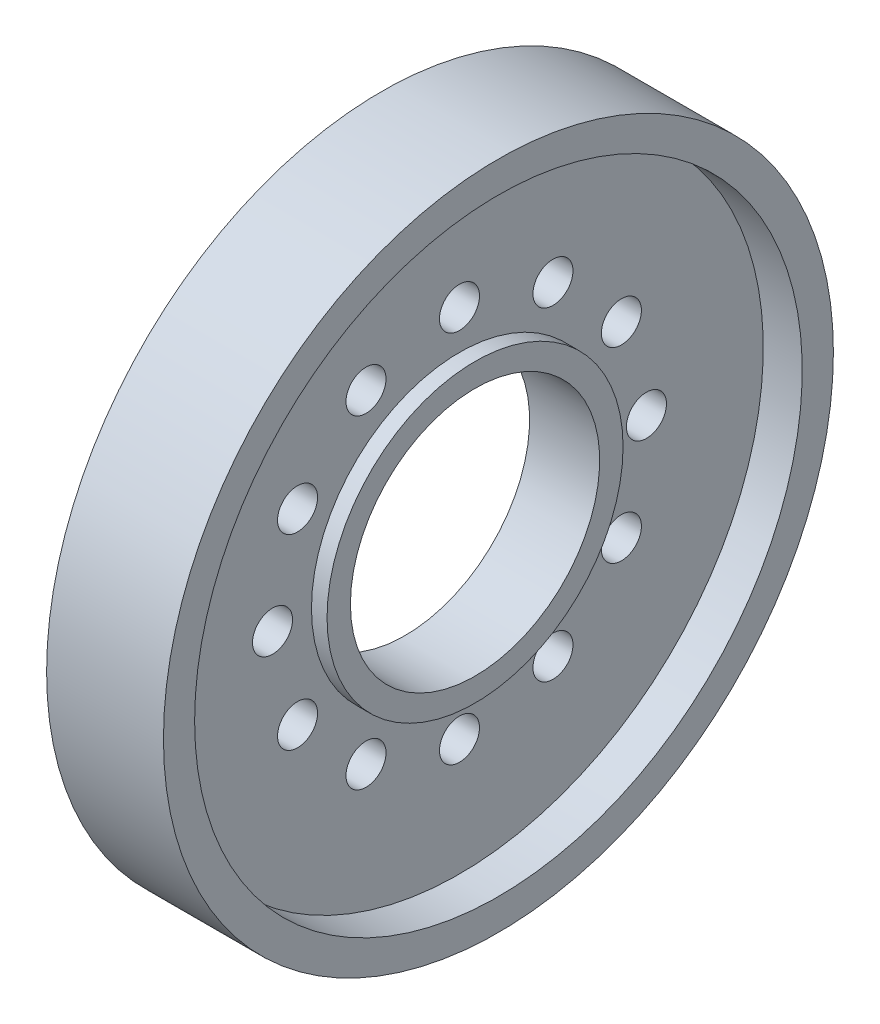
ISO-10303-21;
HEADER;
FILE_DESCRIPTION(('STEP AP214'),'2;1');
FILE_NAME('part.step','',(''),(''),'','','');
FILE_SCHEMA(('AUTOMOTIVE_DESIGN { 1 0 10303 214 1 1 1 1 }'));
ENDSEC;
DATA;
#1=APPLICATION_CONTEXT('core data for automotive mechanical design processes');
#2=APPLICATION_PROTOCOL_DEFINITION('international standard','automotive_design',2000,#1);
#3=PRODUCT_CONTEXT('',#1,'mechanical');
#4=PRODUCT('Part','Part','',(#3));
#5=PRODUCT_RELATED_PRODUCT_CATEGORY('part','',(#4));
#6=PRODUCT_DEFINITION_FORMATION('','',#4);
#7=PRODUCT_DEFINITION_CONTEXT('part definition',#1,'design');
#8=PRODUCT_DEFINITION('design','',#6,#7);
#9=PRODUCT_DEFINITION_SHAPE('','',#8);
#10=(LENGTH_UNIT() NAMED_UNIT(*) SI_UNIT(.MILLI.,.METRE.));
#11=(NAMED_UNIT(*) PLANE_ANGLE_UNIT() SI_UNIT($,.RADIAN.));
#12=(NAMED_UNIT(*) SI_UNIT($,.STERADIAN.) SOLID_ANGLE_UNIT());
#13=UNCERTAINTY_MEASURE_WITH_UNIT(LENGTH_MEASURE(1.E-05),#10,'distance_accuracy_value','');
#14=(GEOMETRIC_REPRESENTATION_CONTEXT(3) GLOBAL_UNCERTAINTY_ASSIGNED_CONTEXT((#13)) GLOBAL_UNIT_ASSIGNED_CONTEXT((#10,
#11,#12)) REPRESENTATION_CONTEXT('',''));
#15=CARTESIAN_POINT('',(0.,0.,0.));
#16=DIRECTION('',(0.,0.,1.));
#17=DIRECTION('',(1.,0.,0.));
#18=AXIS2_PLACEMENT_3D('',#15,#16,#17);
#19=CARTESIAN_POINT('',(-9.525,49.53,0.));
#20=DIRECTION('',(1.,0.,0.));
#21=DIRECTION('',(0.,0.,-1.));
#22=AXIS2_PLACEMENT_3D('',#19,#20,#21);
#23=PLANE('',#22);
#24=CARTESIAN_POINT('',(-9.525,0.,0.));
#25=DIRECTION('',(-1.,0.,0.));
#26=DIRECTION('',(0.,0.,1.));
#27=AXIS2_PLACEMENT_3D('',#24,#25,#26);
#28=CIRCLE('',#27,49.53);
#29=CARTESIAN_POINT('',(-9.525,0.,49.53));
#30=VERTEX_POINT('',#29);
#31=EDGE_CURVE('E63',#30,#30,#28,.T.);
#32=ORIENTED_EDGE('',*,*,#31,.F.);
#33=EDGE_LOOP('',(#32));
#34=FACE_BOUND('',#33,.T.);
#35=CARTESIAN_POINT('',(-9.525,0.,0.));
#36=DIRECTION('',(-1.,0.,0.));
#37=DIRECTION('',(0.,0.,1.));
#38=AXIS2_PLACEMENT_3D('',#35,#36,#37);
#39=CIRCLE('',#38,54.61);
#40=CARTESIAN_POINT('',(-9.525,0.,54.61));
#41=VERTEX_POINT('',#40);
#42=EDGE_CURVE('E10',#41,#41,#39,.T.);
#43=ORIENTED_EDGE('',*,*,#42,.T.);
#44=EDGE_LOOP('',(#43));
#45=FACE_BOUND('',#44,.T.);
#46=ADVANCED_FACE('F41',(#34,#45),#23,.F.);
#47=CARTESIAN_POINT('',(-31.2933707865168,0.,0.));
#48=DIRECTION('',(-1.,0.,0.));
#49=DIRECTION('',(0.,0.,1.));
#50=AXIS2_PLACEMENT_3D('',#47,#48,#49);
#51=CYLINDRICAL_SURFACE('',#50,54.61);
#52=ORIENTED_EDGE('',*,*,#42,.F.);
#53=EDGE_LOOP('',(#52));
#54=FACE_BOUND('',#53,.T.);
#55=CARTESIAN_POINT('',(9.525,0.,0.));
#56=DIRECTION('',(-1.,0.,0.));
#57=DIRECTION('',(0.,0.,1.));
#58=AXIS2_PLACEMENT_3D('',#55,#56,#57);
#59=CIRCLE('',#58,54.61);
#60=CARTESIAN_POINT('',(9.525,0.,54.61));
#61=VERTEX_POINT('',#60);
#62=EDGE_CURVE('E49',#61,#61,#59,.T.);
#63=ORIENTED_EDGE('',*,*,#62,.T.);
#64=EDGE_LOOP('',(#63));
#65=FACE_BOUND('',#64,.T.);
#66=ADVANCED_FACE('F215',(#54,#65),#51,.T.);
#67=CARTESIAN_POINT('',(9.525,54.61,0.));
#68=DIRECTION('',(-1.,0.,0.));
#69=DIRECTION('',(0.,0.,1.));
#70=AXIS2_PLACEMENT_3D('',#67,#68,#69);
#71=PLANE('',#70);
#72=ORIENTED_EDGE('',*,*,#62,.F.);
#73=EDGE_LOOP('',(#72));
#74=FACE_BOUND('',#73,.T.);
#75=CARTESIAN_POINT('',(9.525,0.,0.));
#76=DIRECTION('',(-1.,0.,0.));
#77=DIRECTION('',(0.,0.,1.));
#78=AXIS2_PLACEMENT_3D('',#75,#76,#77);
#79=CIRCLE('',#78,49.53);
#80=CARTESIAN_POINT('',(9.525,0.,49.53));
#81=VERTEX_POINT('',#80);
#82=EDGE_CURVE('E55',#81,#81,#79,.T.);
#83=ORIENTED_EDGE('',*,*,#82,.T.);
#84=EDGE_LOOP('',(#83));
#85=FACE_BOUND('',#84,.T.);
#86=ADVANCED_FACE('F156',(#74,#85),#71,.F.);
#87=CARTESIAN_POINT('',(-31.2933707865168,0.,0.));
#88=DIRECTION('',(-1.,0.,0.));
#89=DIRECTION('',(0.,0.,1.));
#90=AXIS2_PLACEMENT_3D('',#87,#88,#89);
#91=CYLINDRICAL_SURFACE('',#90,49.53);
#92=ORIENTED_EDGE('',*,*,#82,.F.);
#93=EDGE_LOOP('',(#92));
#94=FACE_BOUND('',#93,.T.);
#95=CARTESIAN_POINT('',(3.175,0.,0.));
#96=DIRECTION('',(-1.,0.,0.));
#97=DIRECTION('',(0.,0.,1.));
#98=AXIS2_PLACEMENT_3D('',#95,#96,#97);
#99=CIRCLE('',#98,49.53);
#100=CARTESIAN_POINT('',(3.175,0.,49.53));
#101=VERTEX_POINT('',#100);
#102=EDGE_CURVE('E149',#101,#101,#99,.T.);
#103=ORIENTED_EDGE('',*,*,#102,.T.);
#104=EDGE_LOOP('',(#103));
#105=FACE_BOUND('',#104,.T.);
#106=ADVANCED_FACE('F158',(#94,#105),#91,.F.);
#107=CARTESIAN_POINT('',(3.175,49.53,0.));
#108=DIRECTION('',(-1.,0.,0.));
#109=DIRECTION('',(0.,0.,1.));
#110=AXIS2_PLACEMENT_3D('',#107,#108,#109);
#111=PLANE('',#110);
#112=CARTESIAN_POINT('',(3.175,15.2399999999999,-26.3964543073497));
#113=DIRECTION('',(1.,0.,0.));
#114=DIRECTION('',(0.,-0.86602540378444,-0.499999999999998));
#115=AXIS2_PLACEMENT_3D('',#112,#113,#114);
#116=CIRCLE('',#115,3.2639);
#117=CARTESIAN_POINT('',(3.175,12.4133796845879,-28.0284043073497));
#118=VERTEX_POINT('',#117);
#119=EDGE_CURVE('E301',#118,#118,#116,.T.);
#120=ORIENTED_EDGE('',*,*,#119,.F.);
#121=EDGE_LOOP('',(#120));
#122=FACE_BOUND('',#121,.T.);
#123=CARTESIAN_POINT('',(3.175,-1.06420351207939E-13,-30.48));
#124=DIRECTION('',(1.,0.,0.));
#125=DIRECTION('',(0.,-1.,0.));
#126=AXIS2_PLACEMENT_3D('',#123,#124,#125);
#127=CIRCLE('',#126,3.2639);
#128=CARTESIAN_POINT('',(3.175,-3.26390000000011,-30.48));
#129=VERTEX_POINT('',#128);
#130=EDGE_CURVE('E305',#129,#129,#127,.T.);
#131=ORIENTED_EDGE('',*,*,#130,.F.);
#132=EDGE_LOOP('',(#131));
#133=FACE_BOUND('',#132,.T.);
#134=CARTESIAN_POINT('',(3.175,-15.2400000000001,-26.3964543073496));
#135=DIRECTION('',(1.,0.,0.));
#136=DIRECTION('',(0.,-0.866025403784436,0.500000000000004));
#137=AXIS2_PLACEMENT_3D('',#134,#135,#136);
#138=CIRCLE('',#137,3.2639);
#139=CARTESIAN_POINT('',(3.175,-18.0666203154121,-24.7645043073496));
#140=VERTEX_POINT('',#139);
#141=EDGE_CURVE('E309',#140,#140,#138,.T.);
#142=ORIENTED_EDGE('',*,*,#141,.F.);
#143=EDGE_LOOP('',(#142));
#144=FACE_BOUND('',#143,.T.);
#145=CARTESIAN_POINT('',(3.175,-26.3964543073498,-15.2399999999998));
#146=DIRECTION('',(1.,0.,0.));
#147=DIRECTION('',(0.,-0.499999999999995,0.866025403784442));
#148=AXIS2_PLACEMENT_3D('',#145,#146,#147);
#149=CIRCLE('',#148,3.2639);
#150=CARTESIAN_POINT('',(3.175,-28.0284043073498,-12.4133796845878));
#151=VERTEX_POINT('',#150);
#152=EDGE_CURVE('E313',#151,#151,#149,.T.);
#153=ORIENTED_EDGE('',*,*,#152,.F.);
#154=EDGE_LOOP('',(#153));
#155=FACE_BOUND('',#154,.T.);
#156=CARTESIAN_POINT('',(3.175,-30.48,0.));
#157=DIRECTION('',(1.,0.,0.));
#158=DIRECTION('',(0.,0.,1.));
#159=AXIS2_PLACEMENT_3D('',#156,#157,#158);
#160=CIRCLE('',#159,3.2639);
#161=CARTESIAN_POINT('',(3.175,-30.48,3.2639));
#162=VERTEX_POINT('',#161);
#163=EDGE_CURVE('E317',#162,#162,#160,.T.);
#164=ORIENTED_EDGE('',*,*,#163,.F.);
#165=EDGE_LOOP('',(#164));
#166=FACE_BOUND('',#165,.T.);
#167=CARTESIAN_POINT('',(3.175,-26.3964543073496,15.2400000000002));
#168=DIRECTION('',(1.,0.,0.));
#169=DIRECTION('',(0.,0.500000000000007,0.866025403784435));
#170=AXIS2_PLACEMENT_3D('',#167,#168,#169);
#171=CIRCLE('',#170,3.2639);
#172=CARTESIAN_POINT('',(3.175,-24.7645043073495,18.0666203154122));
#173=VERTEX_POINT('',#172);
#174=EDGE_CURVE('E321',#173,#173,#171,.T.);
#175=ORIENTED_EDGE('',*,*,#174,.F.);
#176=EDGE_LOOP('',(#175));
#177=FACE_BOUND('',#176,.T.);
#178=CARTESIAN_POINT('',(3.175,-15.2399999999998,26.3964543073498));
#179=DIRECTION('',(1.,0.,0.));
#180=DIRECTION('',(0.,0.866025403784443,0.499999999999992));
#181=AXIS2_PLACEMENT_3D('',#178,#179,#180);
#182=CIRCLE('',#181,3.2639);
#183=CARTESIAN_POINT('',(3.175,-12.4133796845877,28.0284043073498));
#184=VERTEX_POINT('',#183);
#185=EDGE_CURVE('E297',#184,#184,#182,.T.);
#186=ORIENTED_EDGE('',*,*,#185,.F.);
#187=EDGE_LOOP('',(#186));
#188=FACE_BOUND('',#187,.T.);
#189=CARTESIAN_POINT('',(3.175,3.19261053623816E-13,30.48));
#190=DIRECTION('',(1.,0.,0.));
#191=DIRECTION('',(0.,1.,0.));
#192=AXIS2_PLACEMENT_3D('',#189,#190,#191);
#193=CIRCLE('',#192,3.2639);
#194=CARTESIAN_POINT('',(3.175,3.26390000000032,30.48));
#195=VERTEX_POINT('',#194);
#196=EDGE_CURVE('E291',#195,#195,#193,.T.);
#197=ORIENTED_EDGE('',*,*,#196,.F.);
#198=EDGE_LOOP('',(#197));
#199=FACE_BOUND('',#198,.T.);
#200=CARTESIAN_POINT('',(3.175,15.2400000000003,26.3964543073495));
#201=DIRECTION('',(1.,0.,0.));
#202=DIRECTION('',(0.,0.866025403784433,-0.50000000000001));
#203=AXIS2_PLACEMENT_3D('',#200,#201,#202);
#204=CIRCLE('',#203,3.2639);
#205=CARTESIAN_POINT('',(3.175,18.0666203154123,24.7645043073495));
#206=VERTEX_POINT('',#205);
#207=EDGE_CURVE('E277',#206,#206,#204,.T.);
#208=ORIENTED_EDGE('',*,*,#207,.F.);
#209=EDGE_LOOP('',(#208));
#210=FACE_BOUND('',#209,.T.);
#211=CARTESIAN_POINT('',(3.175,26.3964543073499,15.2399999999997));
#212=DIRECTION('',(1.,0.,0.));
#213=DIRECTION('',(0.,0.499999999999989,-0.866025403784445));
#214=AXIS2_PLACEMENT_3D('',#211,#212,#213);
#215=CIRCLE('',#214,3.2639);
#216=CARTESIAN_POINT('',(3.175,28.0284043073498,12.4133796845876));
#217=VERTEX_POINT('',#216);
#218=EDGE_CURVE('E292',#217,#217,#215,.T.);
#219=ORIENTED_EDGE('',*,*,#218,.F.);
#220=EDGE_LOOP('',(#219));
#221=FACE_BOUND('',#220,.T.);
#222=CARTESIAN_POINT('',(3.175,26.3964543073497,-15.24));
#223=DIRECTION('',(1.,0.,0.));
#224=DIRECTION('',(0.,-0.500000000000001,-0.866025403784438));
#225=AXIS2_PLACEMENT_3D('',#222,#223,#224);
#226=CIRCLE('',#225,3.2639);
#227=CARTESIAN_POINT('',(3.175,24.7645043073497,-18.0666203154121));
#228=VERTEX_POINT('',#227);
#229=EDGE_CURVE('E70',#228,#228,#226,.T.);
#230=ORIENTED_EDGE('',*,*,#229,.F.);
#231=EDGE_LOOP('',(#230));
#232=FACE_BOUND('',#231,.T.);
#233=CARTESIAN_POINT('',(3.175,30.48,0.));
#234=DIRECTION('',(1.,0.,0.));
#235=DIRECTION('',(0.,0.,-1.));
#236=AXIS2_PLACEMENT_3D('',#233,#234,#235);
#237=CIRCLE('',#236,3.2639);
#238=CARTESIAN_POINT('',(3.175,30.48,-3.2639));
#239=VERTEX_POINT('',#238);
#240=EDGE_CURVE('E64',#239,#239,#237,.T.);
#241=ORIENTED_EDGE('',*,*,#240,.F.);
#242=EDGE_LOOP('',(#241));
#243=FACE_BOUND('',#242,.T.);
#244=ORIENTED_EDGE('',*,*,#102,.F.);
#245=EDGE_LOOP('',(#244));
#246=FACE_BOUND('',#245,.T.);
#247=CARTESIAN_POINT('',(3.175,0.,0.));
#248=DIRECTION('',(-1.,0.,0.));
#249=DIRECTION('',(0.,0.,1.));
#250=AXIS2_PLACEMENT_3D('',#247,#248,#249);
#251=CIRCLE('',#250,24.13);
#252=CARTESIAN_POINT('',(3.175,0.,24.13));
#253=VERTEX_POINT('',#252);
#254=EDGE_CURVE('E145',#253,#253,#251,.T.);
#255=ORIENTED_EDGE('',*,*,#254,.T.);
#256=EDGE_LOOP('',(#255));
#257=FACE_BOUND('',#256,.T.);
#258=ADVANCED_FACE('F161',(#122,#133,#144,#155,#166,#177,#188,#199,#210,#221,#232,#243,#246,
#257),#111,.F.);
#259=CARTESIAN_POINT('',(-31.2933707865168,0.,0.));
#260=DIRECTION('',(-1.,0.,0.));
#261=DIRECTION('',(0.,0.,1.));
#262=AXIS2_PLACEMENT_3D('',#259,#260,#261);
#263=CYLINDRICAL_SURFACE('',#262,24.13);
#264=ORIENTED_EDGE('',*,*,#254,.F.);
#265=EDGE_LOOP('',(#264));
#266=FACE_BOUND('',#265,.T.);
#267=CARTESIAN_POINT('',(5.715,0.,0.));
#268=DIRECTION('',(-1.,0.,0.));
#269=DIRECTION('',(0.,0.,1.));
#270=AXIS2_PLACEMENT_3D('',#267,#268,#269);
#271=CIRCLE('',#270,24.13);
#272=CARTESIAN_POINT('',(5.715,0.,24.13));
#273=VERTEX_POINT('',#272);
#274=EDGE_CURVE('E141',#273,#273,#271,.T.);
#275=ORIENTED_EDGE('',*,*,#274,.T.);
#276=EDGE_LOOP('',(#275));
#277=FACE_BOUND('',#276,.T.);
#278=ADVANCED_FACE('F167',(#266,#277),#263,.T.);
#279=CARTESIAN_POINT('',(5.715,20.32,0.));
#280=DIRECTION('',(-1.,0.,0.));
#281=DIRECTION('',(0.,0.,1.));
#282=AXIS2_PLACEMENT_3D('',#279,#280,#281);
#283=PLANE('',#282);
#284=ORIENTED_EDGE('',*,*,#274,.F.);
#285=EDGE_LOOP('',(#284));
#286=FACE_BOUND('',#285,.T.);
#287=CARTESIAN_POINT('',(5.715,0.,0.));
#288=DIRECTION('',(-1.,0.,0.));
#289=DIRECTION('',(0.,0.,1.));
#290=AXIS2_PLACEMENT_3D('',#287,#288,#289);
#291=CIRCLE('',#290,20.32);
#292=CARTESIAN_POINT('',(5.715,0.,20.32));
#293=VERTEX_POINT('',#292);
#294=EDGE_CURVE('E137',#293,#293,#291,.T.);
#295=ORIENTED_EDGE('',*,*,#294,.T.);
#296=EDGE_LOOP('',(#295));
#297=FACE_BOUND('',#296,.T.);
#298=ADVANCED_FACE('F174',(#286,#297),#283,.F.);
#299=CARTESIAN_POINT('',(-31.2933707865168,0.,0.));
#300=DIRECTION('',(-1.,0.,0.));
#301=DIRECTION('',(0.,0.,1.));
#302=AXIS2_PLACEMENT_3D('',#299,#300,#301);
#303=CYLINDRICAL_SURFACE('',#302,20.32);
#304=ORIENTED_EDGE('',*,*,#294,.F.);
#305=EDGE_LOOP('',(#304));
#306=FACE_BOUND('',#305,.T.);
#307=CARTESIAN_POINT('',(-5.715,0.,0.));
#308=DIRECTION('',(-1.,0.,0.));
#309=DIRECTION('',(0.,0.,1.));
#310=AXIS2_PLACEMENT_3D('',#307,#308,#309);
#311=CIRCLE('',#310,20.32);
#312=CARTESIAN_POINT('',(-5.715,0.,20.32));
#313=VERTEX_POINT('',#312);
#314=EDGE_CURVE('E133',#313,#313,#311,.T.);
#315=ORIENTED_EDGE('',*,*,#314,.T.);
#316=EDGE_LOOP('',(#315));
#317=FACE_BOUND('',#316,.T.);
#318=ADVANCED_FACE('F180',(#306,#317),#303,.F.);
#319=CARTESIAN_POINT('',(-5.715,24.13,0.));
#320=DIRECTION('',(1.,0.,0.));
#321=DIRECTION('',(0.,0.,-1.));
#322=AXIS2_PLACEMENT_3D('',#319,#320,#321);
#323=PLANE('',#322);
#324=ORIENTED_EDGE('',*,*,#314,.F.);
#325=EDGE_LOOP('',(#324));
#326=FACE_BOUND('',#325,.T.);
#327=CARTESIAN_POINT('',(-5.715,0.,0.));
#328=DIRECTION('',(-1.,0.,0.));
#329=DIRECTION('',(0.,0.,1.));
#330=AXIS2_PLACEMENT_3D('',#327,#328,#329);
#331=CIRCLE('',#330,24.13);
#332=CARTESIAN_POINT('',(-5.715,0.,24.13));
#333=VERTEX_POINT('',#332);
#334=EDGE_CURVE('E129',#333,#333,#331,.T.);
#335=ORIENTED_EDGE('',*,*,#334,.T.);
#336=EDGE_LOOP('',(#335));
#337=FACE_BOUND('',#336,.T.);
#338=ADVANCED_FACE('F186',(#326,#337),#323,.F.);
#339=CARTESIAN_POINT('',(-31.2933707865168,0.,0.));
#340=DIRECTION('',(-1.,0.,0.));
#341=DIRECTION('',(0.,0.,1.));
#342=AXIS2_PLACEMENT_3D('',#339,#340,#341);
#343=CYLINDRICAL_SURFACE('',#342,24.13);
#344=ORIENTED_EDGE('',*,*,#334,.F.);
#345=EDGE_LOOP('',(#344));
#346=FACE_BOUND('',#345,.T.);
#347=CARTESIAN_POINT('',(-3.175,0.,0.));
#348=DIRECTION('',(-1.,0.,0.));
#349=DIRECTION('',(0.,0.,1.));
#350=AXIS2_PLACEMENT_3D('',#347,#348,#349);
#351=CIRCLE('',#350,24.13);
#352=CARTESIAN_POINT('',(-3.175,0.,24.13));
#353=VERTEX_POINT('',#352);
#354=EDGE_CURVE('E125',#353,#353,#351,.T.);
#355=ORIENTED_EDGE('',*,*,#354,.T.);
#356=EDGE_LOOP('',(#355));
#357=FACE_BOUND('',#356,.T.);
#358=ADVANCED_FACE('F192',(#346,#357),#343,.T.);
#359=CARTESIAN_POINT('',(-3.175,24.13,0.));
#360=DIRECTION('',(1.,0.,0.));
#361=DIRECTION('',(0.,0.,-1.));
#362=AXIS2_PLACEMENT_3D('',#359,#360,#361);
#363=PLANE('',#362);
#364=CARTESIAN_POINT('',(-3.175,15.2399999999999,-26.3964543073497));
#365=DIRECTION('',(1.,0.,0.));
#366=DIRECTION('',(0.,0.,-1.));
#367=AXIS2_PLACEMENT_3D('',#364,#365,#366);
#368=CIRCLE('',#367,3.2639);
#369=CARTESIAN_POINT('',(-3.175,15.2399999999999,-29.6603543073497));
#370=VERTEX_POINT('',#369);
#371=EDGE_CURVE('E44',#370,#370,#368,.T.);
#372=ORIENTED_EDGE('',*,*,#371,.T.);
#373=EDGE_LOOP('',(#372));
#374=FACE_BOUND('',#373,.T.);
#375=CARTESIAN_POINT('',(-3.175,-1.06420351207939E-13,-30.48));
#376=DIRECTION('',(1.,0.,0.));
#377=DIRECTION('',(0.,0.,-1.));
#378=AXIS2_PLACEMENT_3D('',#375,#376,#377);
#379=CIRCLE('',#378,3.2639);
#380=CARTESIAN_POINT('',(-3.175,-1.06420351207939E-13,-33.7439));
#381=VERTEX_POINT('',#380);
#382=EDGE_CURVE('E101',#381,#381,#379,.T.);
#383=ORIENTED_EDGE('',*,*,#382,.T.);
#384=EDGE_LOOP('',(#383));
#385=FACE_BOUND('',#384,.T.);
#386=CARTESIAN_POINT('',(-3.175,-15.2400000000001,-26.3964543073496));
#387=DIRECTION('',(1.,0.,0.));
#388=DIRECTION('',(0.,0.,-1.));
#389=AXIS2_PLACEMENT_3D('',#386,#387,#388);
#390=CIRCLE('',#389,3.2639);
#391=CARTESIAN_POINT('',(-3.175,-15.2400000000001,-29.6603543073496));
#392=VERTEX_POINT('',#391);
#393=EDGE_CURVE('E98',#392,#392,#390,.T.);
#394=ORIENTED_EDGE('',*,*,#393,.T.);
#395=EDGE_LOOP('',(#394));
#396=FACE_BOUND('',#395,.T.);
#397=CARTESIAN_POINT('',(-3.175,-26.3964543073498,-15.2399999999998));
#398=DIRECTION('',(1.,0.,0.));
#399=DIRECTION('',(0.,0.,-1.));
#400=AXIS2_PLACEMENT_3D('',#397,#398,#399);
#401=CIRCLE('',#400,3.2639);
#402=CARTESIAN_POINT('',(-3.175,-26.3964543073498,-18.5038999999998));
#403=VERTEX_POINT('',#402);
#404=EDGE_CURVE('E94',#403,#403,#401,.T.);
#405=ORIENTED_EDGE('',*,*,#404,.T.);
#406=EDGE_LOOP('',(#405));
#407=FACE_BOUND('',#406,.T.);
#408=CARTESIAN_POINT('',(-3.175,-30.48,0.));
#409=DIRECTION('',(1.,0.,0.));
#410=DIRECTION('',(0.,0.,-1.));
#411=AXIS2_PLACEMENT_3D('',#408,#409,#410);
#412=CIRCLE('',#411,3.2639);
#413=CARTESIAN_POINT('',(-3.175,-30.48,-3.2639));
#414=VERTEX_POINT('',#413);
#415=EDGE_CURVE('E90',#414,#414,#412,.T.);
#416=ORIENTED_EDGE('',*,*,#415,.T.);
#417=EDGE_LOOP('',(#416));
#418=FACE_BOUND('',#417,.T.);
#419=CARTESIAN_POINT('',(-3.175,-26.3964543073496,15.2400000000002));
#420=DIRECTION('',(1.,0.,0.));
#421=DIRECTION('',(0.,0.,-1.));
#422=AXIS2_PLACEMENT_3D('',#419,#420,#421);
#423=CIRCLE('',#422,3.2639);
#424=CARTESIAN_POINT('',(-3.175,-26.3964543073496,11.9761000000002));
#425=VERTEX_POINT('',#424);
#426=EDGE_CURVE('E86',#425,#425,#423,.T.);
#427=ORIENTED_EDGE('',*,*,#426,.T.);
#428=EDGE_LOOP('',(#427));
#429=FACE_BOUND('',#428,.T.);
#430=CARTESIAN_POINT('',(-3.175,-15.2399999999998,26.3964543073498));
#431=DIRECTION('',(1.,0.,0.));
#432=DIRECTION('',(0.,0.,-1.));
#433=AXIS2_PLACEMENT_3D('',#430,#431,#432);
#434=CIRCLE('',#433,3.2639);
#435=CARTESIAN_POINT('',(-3.175,-15.2399999999998,23.1325543073498));
#436=VERTEX_POINT('',#435);
#437=EDGE_CURVE('E82',#436,#436,#434,.T.);
#438=ORIENTED_EDGE('',*,*,#437,.T.);
#439=EDGE_LOOP('',(#438));
#440=FACE_BOUND('',#439,.T.);
#441=CARTESIAN_POINT('',(-3.175,3.19261053623816E-13,30.48));
#442=DIRECTION('',(1.,0.,0.));
#443=DIRECTION('',(0.,0.,-1.));
#444=AXIS2_PLACEMENT_3D('',#441,#442,#443);
#445=CIRCLE('',#444,3.2639);
#446=CARTESIAN_POINT('',(-3.175,3.19261053623816E-13,27.2161));
#447=VERTEX_POINT('',#446);
#448=EDGE_CURVE('E78',#447,#447,#445,.T.);
#449=ORIENTED_EDGE('',*,*,#448,.T.);
#450=EDGE_LOOP('',(#449));
#451=FACE_BOUND('',#450,.T.);
#452=CARTESIAN_POINT('',(-3.175,15.2400000000003,26.3964543073495));
#453=DIRECTION('',(1.,0.,0.));
#454=DIRECTION('',(0.,0.,-1.));
#455=AXIS2_PLACEMENT_3D('',#452,#453,#454);
#456=CIRCLE('',#455,3.2639);
#457=CARTESIAN_POINT('',(-3.175,15.2400000000003,23.1325543073495));
#458=VERTEX_POINT('',#457);
#459=EDGE_CURVE('E74',#458,#458,#456,.T.);
#460=ORIENTED_EDGE('',*,*,#459,.T.);
#461=EDGE_LOOP('',(#460));
#462=FACE_BOUND('',#461,.T.);
#463=CARTESIAN_POINT('',(-3.175,26.3964543073499,15.2399999999997));
#464=DIRECTION('',(1.,0.,0.));
#465=DIRECTION('',(0.,0.,-1.));
#466=AXIS2_PLACEMENT_3D('',#463,#464,#465);
#467=CIRCLE('',#466,3.2639);
#468=CARTESIAN_POINT('',(-3.175,26.3964543073499,11.9760999999997));
#469=VERTEX_POINT('',#468);
#470=EDGE_CURVE('E69',#469,#469,#467,.T.);
#471=ORIENTED_EDGE('',*,*,#470,.T.);
#472=EDGE_LOOP('',(#471));
#473=FACE_BOUND('',#472,.T.);
#474=CARTESIAN_POINT('',(-3.175,26.3964543073497,-15.24));
#475=DIRECTION('',(1.,0.,0.));
#476=DIRECTION('',(0.,0.,-1.));
#477=AXIS2_PLACEMENT_3D('',#474,#475,#476);
#478=CIRCLE('',#477,3.2639);
#479=CARTESIAN_POINT('',(-3.175,26.3964543073497,-18.5039));
#480=VERTEX_POINT('',#479);
#481=EDGE_CURVE('E65',#480,#480,#478,.T.);
#482=ORIENTED_EDGE('',*,*,#481,.T.);
#483=EDGE_LOOP('',(#482));
#484=FACE_BOUND('',#483,.T.);
#485=CARTESIAN_POINT('',(-3.175,30.48,0.));
#486=DIRECTION('',(1.,0.,0.));
#487=DIRECTION('',(0.,0.,-1.));
#488=AXIS2_PLACEMENT_3D('',#485,#486,#487);
#489=CIRCLE('',#488,3.2639);
#490=CARTESIAN_POINT('',(-3.175,30.48,-3.2639));
#491=VERTEX_POINT('',#490);
#492=EDGE_CURVE('E59',#491,#491,#489,.T.);
#493=ORIENTED_EDGE('',*,*,#492,.T.);
#494=EDGE_LOOP('',(#493));
#495=FACE_BOUND('',#494,.T.);
#496=ORIENTED_EDGE('',*,*,#354,.F.);
#497=EDGE_LOOP('',(#496));
#498=FACE_BOUND('',#497,.T.);
#499=CARTESIAN_POINT('',(-3.175,0.,0.));
#500=DIRECTION('',(-1.,0.,0.));
#501=DIRECTION('',(0.,0.,1.));
#502=AXIS2_PLACEMENT_3D('',#499,#500,#501);
#503=CIRCLE('',#502,49.53);
#504=CARTESIAN_POINT('',(-3.175,0.,49.53));
#505=VERTEX_POINT('',#504);
#506=EDGE_CURVE('E121',#505,#505,#503,.T.);
#507=ORIENTED_EDGE('',*,*,#506,.T.);
#508=EDGE_LOOP('',(#507));
#509=FACE_BOUND('',#508,.T.);
#510=ADVANCED_FACE('F198',(#374,#385,#396,#407,#418,#429,#440,#451,#462,#473,#484,#495,#498,
#509),#363,.F.);
#511=CARTESIAN_POINT('',(-31.2933707865168,0.,0.));
#512=DIRECTION('',(-1.,0.,0.));
#513=DIRECTION('',(0.,0.,1.));
#514=AXIS2_PLACEMENT_3D('',#511,#512,#513);
#515=CYLINDRICAL_SURFACE('',#514,49.53);
#516=ORIENTED_EDGE('',*,*,#506,.F.);
#517=EDGE_LOOP('',(#516));
#518=FACE_BOUND('',#517,.T.);
#519=ORIENTED_EDGE('',*,*,#31,.T.);
#520=EDGE_LOOP('',(#519));
#521=FACE_BOUND('',#520,.T.);
#522=ADVANCED_FACE('F204',(#518,#521),#515,.F.);
#523=CARTESIAN_POINT('',(-9.525,30.48,0.));
#524=DIRECTION('',(1.,0.,0.));
#525=DIRECTION('',(0.,0.,-1.));
#526=AXIS2_PLACEMENT_3D('',#523,#524,#525);
#527=CYLINDRICAL_SURFACE('',#526,3.2639);
#528=ORIENTED_EDGE('',*,*,#240,.T.);
#529=EDGE_LOOP('',(#528));
#530=FACE_BOUND('',#529,.T.);
#531=ORIENTED_EDGE('',*,*,#492,.F.);
#532=EDGE_LOOP('',(#531));
#533=FACE_BOUND('',#532,.T.);
#534=ADVANCED_FACE('F210',(#530,#533),#527,.F.);
#535=CARTESIAN_POINT('',(-9.525,26.3964543073497,-15.24));
#536=DIRECTION('',(1.,0.,0.));
#537=DIRECTION('',(0.,0.,-1.));
#538=AXIS2_PLACEMENT_3D('',#535,#536,#537);
#539=CYLINDRICAL_SURFACE('',#538,3.2639);
#540=ORIENTED_EDGE('',*,*,#229,.T.);
#541=EDGE_LOOP('',(#540));
#542=FACE_BOUND('',#541,.T.);
#543=ORIENTED_EDGE('',*,*,#481,.F.);
#544=EDGE_LOOP('',(#543));
#545=FACE_BOUND('',#544,.T.);
#546=ADVANCED_FACE('F229',(#542,#545),#539,.F.);
#547=CARTESIAN_POINT('',(-9.525,26.3964543073499,15.2399999999997));
#548=DIRECTION('',(1.,0.,0.));
#549=DIRECTION('',(0.,0.,-1.));
#550=AXIS2_PLACEMENT_3D('',#547,#548,#549);
#551=CYLINDRICAL_SURFACE('',#550,3.2639);
#552=ORIENTED_EDGE('',*,*,#218,.T.);
#553=EDGE_LOOP('',(#552));
#554=FACE_BOUND('',#553,.T.);
#555=ORIENTED_EDGE('',*,*,#470,.F.);
#556=EDGE_LOOP('',(#555));
#557=FACE_BOUND('',#556,.T.);
#558=ADVANCED_FACE('F232',(#554,#557),#551,.F.);
#559=CARTESIAN_POINT('',(-9.525,15.2400000000003,26.3964543073495));
#560=DIRECTION('',(1.,0.,0.));
#561=DIRECTION('',(0.,0.,-1.));
#562=AXIS2_PLACEMENT_3D('',#559,#560,#561);
#563=CYLINDRICAL_SURFACE('',#562,3.2639);
#564=ORIENTED_EDGE('',*,*,#207,.T.);
#565=EDGE_LOOP('',(#564));
#566=FACE_BOUND('',#565,.T.);
#567=ORIENTED_EDGE('',*,*,#459,.F.);
#568=EDGE_LOOP('',(#567));
#569=FACE_BOUND('',#568,.T.);
#570=ADVANCED_FACE('F238',(#566,#569),#563,.F.);
#571=CARTESIAN_POINT('',(-9.525,3.19261053623816E-13,30.48));
#572=DIRECTION('',(1.,0.,0.));
#573=DIRECTION('',(0.,0.,-1.));
#574=AXIS2_PLACEMENT_3D('',#571,#572,#573);
#575=CYLINDRICAL_SURFACE('',#574,3.2639);
#576=ORIENTED_EDGE('',*,*,#196,.T.);
#577=EDGE_LOOP('',(#576));
#578=FACE_BOUND('',#577,.T.);
#579=ORIENTED_EDGE('',*,*,#448,.F.);
#580=EDGE_LOOP('',(#579));
#581=FACE_BOUND('',#580,.T.);
#582=ADVANCED_FACE('F234',(#578,#581),#575,.F.);
#583=CARTESIAN_POINT('',(-9.525,-15.2399999999998,26.3964543073498));
#584=DIRECTION('',(1.,0.,0.));
#585=DIRECTION('',(0.,0.,-1.));
#586=AXIS2_PLACEMENT_3D('',#583,#584,#585);
#587=CYLINDRICAL_SURFACE('',#586,3.2639);
#588=ORIENTED_EDGE('',*,*,#185,.T.);
#589=EDGE_LOOP('',(#588));
#590=FACE_BOUND('',#589,.T.);
#591=ORIENTED_EDGE('',*,*,#437,.F.);
#592=EDGE_LOOP('',(#591));
#593=FACE_BOUND('',#592,.T.);
#594=ADVANCED_FACE('F237',(#590,#593),#587,.F.);
#595=CARTESIAN_POINT('',(-9.525,-26.3964543073496,15.2400000000002));
#596=DIRECTION('',(1.,0.,0.));
#597=DIRECTION('',(0.,0.,-1.));
#598=AXIS2_PLACEMENT_3D('',#595,#596,#597);
#599=CYLINDRICAL_SURFACE('',#598,3.2639);
#600=ORIENTED_EDGE('',*,*,#174,.T.);
#601=EDGE_LOOP('',(#600));
#602=FACE_BOUND('',#601,.T.);
#603=ORIENTED_EDGE('',*,*,#426,.F.);
#604=EDGE_LOOP('',(#603));
#605=FACE_BOUND('',#604,.T.);
#606=ADVANCED_FACE('F242',(#602,#605),#599,.F.);
#607=CARTESIAN_POINT('',(-9.525,-30.48,0.));
#608=DIRECTION('',(1.,0.,0.));
#609=DIRECTION('',(0.,0.,-1.));
#610=AXIS2_PLACEMENT_3D('',#607,#608,#609);
#611=CYLINDRICAL_SURFACE('',#610,3.2639);
#612=ORIENTED_EDGE('',*,*,#163,.T.);
#613=EDGE_LOOP('',(#612));
#614=FACE_BOUND('',#613,.T.);
#615=ORIENTED_EDGE('',*,*,#415,.F.);
#616=EDGE_LOOP('',(#615));
#617=FACE_BOUND('',#616,.T.);
#618=ADVANCED_FACE('F246',(#614,#617),#611,.F.);
#619=CARTESIAN_POINT('',(-9.525,-26.3964543073498,-15.2399999999998));
#620=DIRECTION('',(1.,0.,0.));
#621=DIRECTION('',(0.,0.,-1.));
#622=AXIS2_PLACEMENT_3D('',#619,#620,#621);
#623=CYLINDRICAL_SURFACE('',#622,3.2639);
#624=ORIENTED_EDGE('',*,*,#152,.T.);
#625=EDGE_LOOP('',(#624));
#626=FACE_BOUND('',#625,.T.);
#627=ORIENTED_EDGE('',*,*,#404,.F.);
#628=EDGE_LOOP('',(#627));
#629=FACE_BOUND('',#628,.T.);
#630=ADVANCED_FACE('F250',(#626,#629),#623,.F.);
#631=CARTESIAN_POINT('',(-9.525,-15.2400000000001,-26.3964543073496));
#632=DIRECTION('',(1.,0.,0.));
#633=DIRECTION('',(0.,0.,-1.));
#634=AXIS2_PLACEMENT_3D('',#631,#632,#633);
#635=CYLINDRICAL_SURFACE('',#634,3.2639);
#636=ORIENTED_EDGE('',*,*,#141,.T.);
#637=EDGE_LOOP('',(#636));
#638=FACE_BOUND('',#637,.T.);
#639=ORIENTED_EDGE('',*,*,#393,.F.);
#640=EDGE_LOOP('',(#639));
#641=FACE_BOUND('',#640,.T.);
#642=ADVANCED_FACE('F254',(#638,#641),#635,.F.);
#643=CARTESIAN_POINT('',(-9.525,-1.06420351207939E-13,-30.48));
#644=DIRECTION('',(1.,0.,0.));
#645=DIRECTION('',(0.,0.,-1.));
#646=AXIS2_PLACEMENT_3D('',#643,#644,#645);
#647=CYLINDRICAL_SURFACE('',#646,3.2639);
#648=ORIENTED_EDGE('',*,*,#130,.T.);
#649=EDGE_LOOP('',(#648));
#650=FACE_BOUND('',#649,.T.);
#651=ORIENTED_EDGE('',*,*,#382,.F.);
#652=EDGE_LOOP('',(#651));
#653=FACE_BOUND('',#652,.T.);
#654=ADVANCED_FACE('F258',(#650,#653),#647,.F.);
#655=CARTESIAN_POINT('',(-9.525,15.2399999999999,-26.3964543073497));
#656=DIRECTION('',(1.,0.,0.));
#657=DIRECTION('',(0.,0.,-1.));
#658=AXIS2_PLACEMENT_3D('',#655,#656,#657);
#659=CYLINDRICAL_SURFACE('',#658,3.2639);
#660=ORIENTED_EDGE('',*,*,#119,.T.);
#661=EDGE_LOOP('',(#660));
#662=FACE_BOUND('',#661,.T.);
#663=ORIENTED_EDGE('',*,*,#371,.F.);
#664=EDGE_LOOP('',(#663));
#665=FACE_BOUND('',#664,.T.);
#666=ADVANCED_FACE('F262',(#662,#665),#659,.F.);
#667=CLOSED_SHELL('',(#46,#66,#86,#106,#258,#278,#298,#318,#338,#358,#510,#522,#534,#546,#558,
#570,#582,#594,#606,#618,#630,#642,#654,#666));
#668=MANIFOLD_SOLID_BREP('B2',#667);
#669=ADVANCED_BREP_SHAPE_REPRESENTATION('',(#18,#668),#14);
#670=SHAPE_DEFINITION_REPRESENTATION(#9,#669);
ENDSEC;
END-ISO-10303-21;
